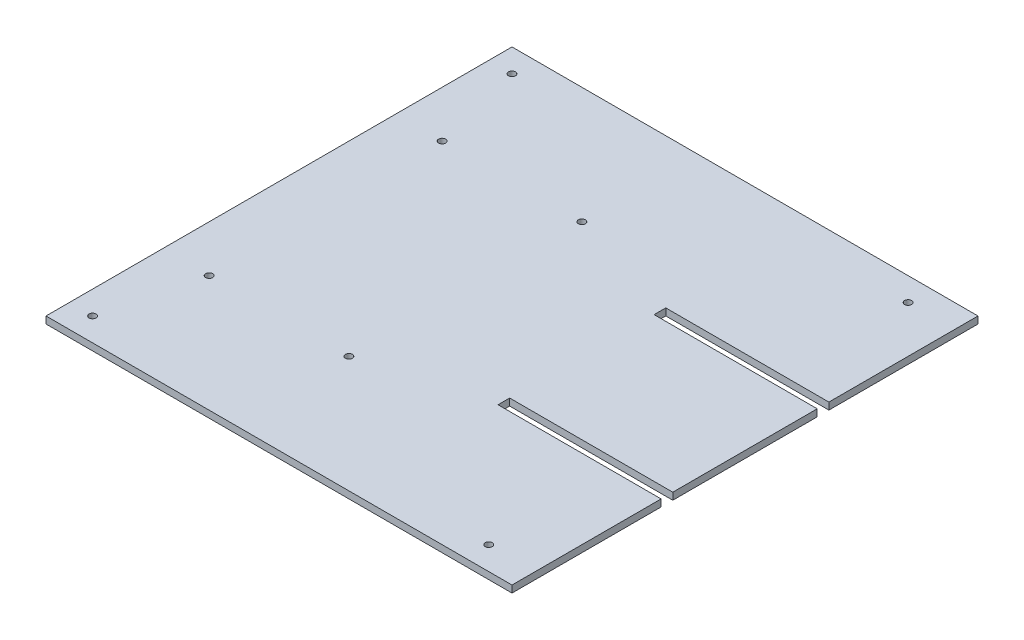
ISO-10303-21;
HEADER;
FILE_DESCRIPTION(('STEP AP214'),'2;1');
FILE_NAME('part.step','',(''),(''),'','','');
FILE_SCHEMA(('AUTOMOTIVE_DESIGN { 1 0 10303 214 1 1 1 1 }'));
ENDSEC;
DATA;
#1=APPLICATION_CONTEXT('core data for automotive mechanical design processes');
#2=APPLICATION_PROTOCOL_DEFINITION('international standard','automotive_design',2000,#1);
#3=PRODUCT_CONTEXT('',#1,'mechanical');
#4=PRODUCT('Part','Part','',(#3));
#5=PRODUCT_RELATED_PRODUCT_CATEGORY('part','',(#4));
#6=PRODUCT_DEFINITION_FORMATION('','',#4);
#7=PRODUCT_DEFINITION_CONTEXT('part definition',#1,'design');
#8=PRODUCT_DEFINITION('design','',#6,#7);
#9=PRODUCT_DEFINITION_SHAPE('','',#8);
#10=(LENGTH_UNIT() NAMED_UNIT(*) SI_UNIT(.MILLI.,.METRE.));
#11=(NAMED_UNIT(*) PLANE_ANGLE_UNIT() SI_UNIT($,.RADIAN.));
#12=(NAMED_UNIT(*) SI_UNIT($,.STERADIAN.) SOLID_ANGLE_UNIT());
#13=UNCERTAINTY_MEASURE_WITH_UNIT(LENGTH_MEASURE(1.E-05),#10,'distance_accuracy_value','');
#14=(GEOMETRIC_REPRESENTATION_CONTEXT(3) GLOBAL_UNCERTAINTY_ASSIGNED_CONTEXT((#13)) GLOBAL_UNIT_ASSIGNED_CONTEXT((#10,
#11,#12)) REPRESENTATION_CONTEXT('',''));
#15=CARTESIAN_POINT('',(0.,0.,0.));
#16=DIRECTION('',(0.,0.,1.));
#17=DIRECTION('',(1.,0.,0.));
#18=AXIS2_PLACEMENT_3D('',#15,#16,#17);
#19=CARTESIAN_POINT('',(100.,3.,100.));
#20=DIRECTION('',(-1.,0.,0.));
#21=DIRECTION('',(0.,0.,1.));
#22=AXIS2_PLACEMENT_3D('',#19,#20,#21);
#23=PLANE('',#22);
#24=DIRECTION('',(0.,0.,-1.));
#25=VECTOR('',#24,1.);
#26=CARTESIAN_POINT('',(100.,0.,100.));
#27=LINE('',#26,#25);
#28=CARTESIAN_POINT('',(100.,0.,31.));
#29=VERTEX_POINT('',#28);
#30=CARTESIAN_POINT('',(100.,0.,-31.));
#31=VERTEX_POINT('',#30);
#32=EDGE_CURVE('E146',#29,#31,#27,.T.);
#33=ORIENTED_EDGE('',*,*,#32,.T.);
#34=DIRECTION('',(0.,1.,0.));
#35=VECTOR('',#34,1.);
#36=CARTESIAN_POINT('',(100.,0.,-31.));
#37=LINE('',#36,#35);
#38=CARTESIAN_POINT('',(100.,3.,-31.));
#39=VERTEX_POINT('',#38);
#40=EDGE_CURVE('E194',#31,#39,#37,.T.);
#41=ORIENTED_EDGE('',*,*,#40,.T.);
#42=DIRECTION('',(0.,0.,-1.));
#43=VECTOR('',#42,1.);
#44=CARTESIAN_POINT('',(100.,3.,100.));
#45=LINE('',#44,#43);
#46=CARTESIAN_POINT('',(100.,3.,31.));
#47=VERTEX_POINT('',#46);
#48=EDGE_CURVE('E230',#47,#39,#45,.T.);
#49=ORIENTED_EDGE('',*,*,#48,.F.);
#50=DIRECTION('',(0.,1.,0.));
#51=VECTOR('',#50,1.);
#52=CARTESIAN_POINT('',(100.,0.,31.));
#53=LINE('',#52,#51);
#54=EDGE_CURVE('E182',#29,#47,#53,.T.);
#55=ORIENTED_EDGE('',*,*,#54,.F.);
#56=EDGE_LOOP('',(#33,#41,#49,#55));
#57=FACE_BOUND('',#56,.T.);
#58=ADVANCED_FACE('F34',(#57),#23,.F.);
#59=CARTESIAN_POINT('',(100.,0.,100.));
#60=VERTEX_POINT('',#59);
#61=CARTESIAN_POINT('',(100.,0.,36.));
#62=VERTEX_POINT('',#61);
#63=EDGE_CURVE('E149',#60,#62,#27,.T.);
#64=ORIENTED_EDGE('',*,*,#63,.T.);
#65=DIRECTION('',(0.,1.,0.));
#66=VECTOR('',#65,1.);
#67=CARTESIAN_POINT('',(100.,0.,36.));
#68=LINE('',#67,#66);
#69=CARTESIAN_POINT('',(100.,3.,36.));
#70=VERTEX_POINT('',#69);
#71=EDGE_CURVE('E199',#62,#70,#68,.T.);
#72=ORIENTED_EDGE('',*,*,#71,.T.);
#73=CARTESIAN_POINT('',(100.,3.,100.));
#74=VERTEX_POINT('',#73);
#75=EDGE_CURVE('E175',#74,#70,#45,.T.);
#76=ORIENTED_EDGE('',*,*,#75,.F.);
#77=DIRECTION('',(0.,-1.,0.));
#78=VECTOR('',#77,1.);
#79=CARTESIAN_POINT('',(100.,3.,100.));
#80=LINE('',#79,#78);
#81=EDGE_CURVE('E42',#74,#60,#80,.T.);
#82=ORIENTED_EDGE('',*,*,#81,.T.);
#83=EDGE_LOOP('',(#64,#72,#76,#82));
#84=FACE_BOUND('',#83,.T.);
#85=ADVANCED_FACE('F173',(#84),#23,.F.);
#86=CARTESIAN_POINT('',(-100.,3.,100.));
#87=DIRECTION('',(1.,0.,0.));
#88=DIRECTION('',(0.,0.,-1.));
#89=AXIS2_PLACEMENT_3D('',#86,#87,#88);
#90=PLANE('',#89);
#91=DIRECTION('',(0.,0.,1.));
#92=VECTOR('',#91,1.);
#93=CARTESIAN_POINT('',(-100.,0.,100.));
#94=LINE('',#93,#92);
#95=CARTESIAN_POINT('',(-100.,0.,-100.));
#96=VERTEX_POINT('',#95);
#97=CARTESIAN_POINT('',(-100.,0.,100.));
#98=VERTEX_POINT('',#97);
#99=EDGE_CURVE('E151',#96,#98,#94,.T.);
#100=ORIENTED_EDGE('',*,*,#99,.T.);
#101=DIRECTION('',(0.,-1.,0.));
#102=VECTOR('',#101,1.);
#103=CARTESIAN_POINT('',(-100.,3.,100.));
#104=LINE('',#103,#102);
#105=CARTESIAN_POINT('',(-100.,3.,100.));
#106=VERTEX_POINT('',#105);
#107=EDGE_CURVE('E11',#106,#98,#104,.T.);
#108=ORIENTED_EDGE('',*,*,#107,.F.);
#109=DIRECTION('',(0.,0.,1.));
#110=VECTOR('',#109,1.);
#111=CARTESIAN_POINT('',(-100.,3.,100.));
#112=LINE('',#111,#110);
#113=CARTESIAN_POINT('',(-100.,3.,-100.));
#114=VERTEX_POINT('',#113);
#115=EDGE_CURVE('E159',#114,#106,#112,.T.);
#116=ORIENTED_EDGE('',*,*,#115,.F.);
#117=DIRECTION('',(0.,-1.,0.));
#118=VECTOR('',#117,1.);
#119=CARTESIAN_POINT('',(-100.,3.,-100.));
#120=LINE('',#119,#118);
#121=EDGE_CURVE('E167',#114,#96,#120,.T.);
#122=ORIENTED_EDGE('',*,*,#121,.T.);
#123=EDGE_LOOP('',(#100,#108,#116,#122));
#124=FACE_BOUND('',#123,.T.);
#125=ADVANCED_FACE('F36',(#124),#90,.F.);
#126=CARTESIAN_POINT('',(100.,3.,100.));
#127=DIRECTION('',(0.,0.,-1.));
#128=DIRECTION('',(-1.,0.,0.));
#129=AXIS2_PLACEMENT_3D('',#126,#127,#128);
#130=PLANE('',#129);
#131=DIRECTION('',(1.,0.,0.));
#132=VECTOR('',#131,1.);
#133=CARTESIAN_POINT('',(100.,0.,100.));
#134=LINE('',#133,#132);
#135=EDGE_CURVE('E147',#98,#60,#134,.T.);
#136=ORIENTED_EDGE('',*,*,#135,.T.);
#137=ORIENTED_EDGE('',*,*,#81,.F.);
#138=DIRECTION('',(1.,0.,0.));
#139=VECTOR('',#138,1.);
#140=CARTESIAN_POINT('',(100.,3.,100.));
#141=LINE('',#140,#139);
#142=EDGE_CURVE('E164',#106,#74,#141,.T.);
#143=ORIENTED_EDGE('',*,*,#142,.F.);
#144=ORIENTED_EDGE('',*,*,#107,.T.);
#145=EDGE_LOOP('',(#136,#137,#143,#144));
#146=FACE_BOUND('',#145,.T.);
#147=ADVANCED_FACE('F285',(#146),#130,.F.);
#148=CARTESIAN_POINT('',(100.,3.,-36.));
#149=VERTEX_POINT('',#148);
#150=CARTESIAN_POINT('',(100.,3.,-100.));
#151=VERTEX_POINT('',#150);
#152=EDGE_CURVE('E139',#149,#151,#45,.T.);
#153=ORIENTED_EDGE('',*,*,#152,.F.);
#154=DIRECTION('',(0.,1.,0.));
#155=VECTOR('',#154,1.);
#156=CARTESIAN_POINT('',(100.,0.,-36.));
#157=LINE('',#156,#155);
#158=CARTESIAN_POINT('',(100.,0.,-36.));
#159=VERTEX_POINT('',#158);
#160=EDGE_CURVE('E126',#159,#149,#157,.T.);
#161=ORIENTED_EDGE('',*,*,#160,.F.);
#162=CARTESIAN_POINT('',(100.,0.,-100.));
#163=VERTEX_POINT('',#162);
#164=EDGE_CURVE('E137',#159,#163,#27,.T.);
#165=ORIENTED_EDGE('',*,*,#164,.T.);
#166=DIRECTION('',(0.,-1.,0.));
#167=VECTOR('',#166,1.);
#168=CARTESIAN_POINT('',(100.,3.,-100.));
#169=LINE('',#168,#167);
#170=EDGE_CURVE('E169',#151,#163,#169,.T.);
#171=ORIENTED_EDGE('',*,*,#170,.F.);
#172=EDGE_LOOP('',(#153,#161,#165,#171));
#173=FACE_BOUND('',#172,.T.);
#174=ADVANCED_FACE('F135',(#173),#23,.F.);
#175=CARTESIAN_POINT('',(100.,3.,-100.));
#176=DIRECTION('',(0.,0.,1.));
#177=DIRECTION('',(1.,0.,0.));
#178=AXIS2_PLACEMENT_3D('',#175,#176,#177);
#179=PLANE('',#178);
#180=DIRECTION('',(-1.,0.,0.));
#181=VECTOR('',#180,1.);
#182=CARTESIAN_POINT('',(100.,0.,-100.));
#183=LINE('',#182,#181);
#184=EDGE_CURVE('E145',#163,#96,#183,.T.);
#185=ORIENTED_EDGE('',*,*,#184,.T.);
#186=ORIENTED_EDGE('',*,*,#121,.F.);
#187=DIRECTION('',(-1.,0.,0.));
#188=VECTOR('',#187,1.);
#189=CARTESIAN_POINT('',(100.,3.,-100.));
#190=LINE('',#189,#188);
#191=EDGE_CURVE('E170',#151,#114,#190,.T.);
#192=ORIENTED_EDGE('',*,*,#191,.F.);
#193=ORIENTED_EDGE('',*,*,#170,.T.);
#194=EDGE_LOOP('',(#185,#186,#192,#193));
#195=FACE_BOUND('',#194,.T.);
#196=ADVANCED_FACE('F237',(#195),#179,.F.);
#197=CARTESIAN_POINT('',(0.,3.,0.));
#198=DIRECTION('',(0.,1.,0.));
#199=DIRECTION('',(0.,0.,1.));
#200=AXIS2_PLACEMENT_3D('',#197,#198,#199);
#201=PLANE('',#200);
#202=CARTESIAN_POINT('',(-20.,3.,-50.));
#203=DIRECTION('',(0.,1.,0.));
#204=DIRECTION('',(0.,0.,1.));
#205=AXIS2_PLACEMENT_3D('',#202,#203,#204);
#206=CIRCLE('',#205,1.5);
#207=CARTESIAN_POINT('',(-20.,3.,-48.5));
#208=VERTEX_POINT('',#207);
#209=EDGE_CURVE('E423',#208,#208,#206,.T.);
#210=ORIENTED_EDGE('',*,*,#209,.F.);
#211=EDGE_LOOP('',(#210));
#212=FACE_BOUND('',#211,.T.);
#213=CARTESIAN_POINT('',(-80.,3.,-50.));
#214=DIRECTION('',(0.,1.,0.));
#215=DIRECTION('',(0.,0.,1.));
#216=AXIS2_PLACEMENT_3D('',#213,#214,#215);
#217=CIRCLE('',#216,1.5);
#218=CARTESIAN_POINT('',(-80.,3.,-48.5));
#219=VERTEX_POINT('',#218);
#220=EDGE_CURVE('E425',#219,#219,#217,.T.);
#221=ORIENTED_EDGE('',*,*,#220,.F.);
#222=EDGE_LOOP('',(#221));
#223=FACE_BOUND('',#222,.T.);
#224=CARTESIAN_POINT('',(-20.,3.,50.0000000000001));
#225=DIRECTION('',(0.,1.,0.));
#226=DIRECTION('',(0.,0.,1.));
#227=AXIS2_PLACEMENT_3D('',#224,#225,#226);
#228=CIRCLE('',#227,1.5);
#229=CARTESIAN_POINT('',(-20.,3.,51.5000000000001));
#230=VERTEX_POINT('',#229);
#231=EDGE_CURVE('E431',#230,#230,#228,.T.);
#232=ORIENTED_EDGE('',*,*,#231,.F.);
#233=EDGE_LOOP('',(#232));
#234=FACE_BOUND('',#233,.T.);
#235=CARTESIAN_POINT('',(-80.,3.,50.));
#236=DIRECTION('',(0.,1.,0.));
#237=DIRECTION('',(0.,0.,1.));
#238=AXIS2_PLACEMENT_3D('',#235,#236,#237);
#239=CIRCLE('',#238,1.5);
#240=CARTESIAN_POINT('',(-80.,3.,51.5));
#241=VERTEX_POINT('',#240);
#242=EDGE_CURVE('E437',#241,#241,#239,.T.);
#243=ORIENTED_EDGE('',*,*,#242,.F.);
#244=EDGE_LOOP('',(#243));
#245=FACE_BOUND('',#244,.T.);
#246=DIRECTION('',(1.,0.,0.));
#247=VECTOR('',#246,1.);
#248=CARTESIAN_POINT('',(30.,3.,-31.));
#249=LINE('',#248,#247);
#250=CARTESIAN_POINT('',(30.,3.,-31.));
#251=VERTEX_POINT('',#250);
#252=EDGE_CURVE('E131',#251,#39,#249,.T.);
#253=ORIENTED_EDGE('',*,*,#252,.F.);
#254=DIRECTION('',(0.,0.,1.));
#255=VECTOR('',#254,1.);
#256=CARTESIAN_POINT('',(30.,3.,-36.));
#257=LINE('',#256,#255);
#258=CARTESIAN_POINT('',(30.,3.,-36.));
#259=VERTEX_POINT('',#258);
#260=EDGE_CURVE('E447',#259,#251,#257,.T.);
#261=ORIENTED_EDGE('',*,*,#260,.F.);
#262=DIRECTION('',(-1.,0.,0.));
#263=VECTOR('',#262,1.);
#264=CARTESIAN_POINT('',(100.,3.,-36.));
#265=LINE('',#264,#263);
#266=EDGE_CURVE('E243',#149,#259,#265,.T.);
#267=ORIENTED_EDGE('',*,*,#266,.F.);
#268=ORIENTED_EDGE('',*,*,#152,.T.);
#269=ORIENTED_EDGE('',*,*,#191,.T.);
#270=ORIENTED_EDGE('',*,*,#115,.T.);
#271=ORIENTED_EDGE('',*,*,#142,.T.);
#272=ORIENTED_EDGE('',*,*,#75,.T.);
#273=DIRECTION('',(1.,0.,0.));
#274=VECTOR('',#273,1.);
#275=CARTESIAN_POINT('',(100.,3.,36.));
#276=LINE('',#275,#274);
#277=CARTESIAN_POINT('',(30.,3.,36.));
#278=VERTEX_POINT('',#277);
#279=EDGE_CURVE('E197',#278,#70,#276,.T.);
#280=ORIENTED_EDGE('',*,*,#279,.F.);
#281=DIRECTION('',(0.,0.,1.));
#282=VECTOR('',#281,1.);
#283=CARTESIAN_POINT('',(30.,3.,36.));
#284=LINE('',#283,#282);
#285=CARTESIAN_POINT('',(30.,3.,31.));
#286=VERTEX_POINT('',#285);
#287=EDGE_CURVE('E193',#286,#278,#284,.T.);
#288=ORIENTED_EDGE('',*,*,#287,.F.);
#289=DIRECTION('',(-1.,0.,0.));
#290=VECTOR('',#289,1.);
#291=CARTESIAN_POINT('',(30.,3.,31.));
#292=LINE('',#291,#290);
#293=EDGE_CURVE('E190',#47,#286,#292,.T.);
#294=ORIENTED_EDGE('',*,*,#293,.F.);
#295=ORIENTED_EDGE('',*,*,#48,.T.);
#296=EDGE_LOOP('',(#253,#261,#267,#268,#269,#270,#271,#272,#280,#288,#294,#295));
#297=FACE_BOUND('',#296,.T.);
#298=CARTESIAN_POINT('',(-90.0000000000001,3.,-90.));
#299=DIRECTION('',(0.,1.,0.));
#300=DIRECTION('',(0.,0.,-1.));
#301=AXIS2_PLACEMENT_3D('',#298,#299,#300);
#302=CIRCLE('',#301,1.5);
#303=CARTESIAN_POINT('',(-90.0000000000001,3.,-91.5));
#304=VERTEX_POINT('',#303);
#305=EDGE_CURVE('E201',#304,#304,#302,.T.);
#306=ORIENTED_EDGE('',*,*,#305,.F.);
#307=EDGE_LOOP('',(#306));
#308=FACE_BOUND('',#307,.T.);
#309=CARTESIAN_POINT('',(80.,3.,-90.));
#310=DIRECTION('',(0.,1.,0.));
#311=DIRECTION('',(0.,0.,-1.));
#312=AXIS2_PLACEMENT_3D('',#309,#310,#311);
#313=CIRCLE('',#312,1.5);
#314=CARTESIAN_POINT('',(80.,3.,-91.5));
#315=VERTEX_POINT('',#314);
#316=EDGE_CURVE('E208',#315,#315,#313,.T.);
#317=ORIENTED_EDGE('',*,*,#316,.F.);
#318=EDGE_LOOP('',(#317));
#319=FACE_BOUND('',#318,.T.);
#320=CARTESIAN_POINT('',(80.,3.,90.));
#321=DIRECTION('',(0.,1.,0.));
#322=DIRECTION('',(0.,0.,1.));
#323=AXIS2_PLACEMENT_3D('',#320,#321,#322);
#324=CIRCLE('',#323,1.5);
#325=CARTESIAN_POINT('',(80.,3.,91.5));
#326=VERTEX_POINT('',#325);
#327=EDGE_CURVE('E214',#326,#326,#324,.T.);
#328=ORIENTED_EDGE('',*,*,#327,.F.);
#329=EDGE_LOOP('',(#328));
#330=FACE_BOUND('',#329,.T.);
#331=CARTESIAN_POINT('',(-90.,3.,90.));
#332=DIRECTION('',(0.,1.,0.));
#333=DIRECTION('',(0.,0.,1.));
#334=AXIS2_PLACEMENT_3D('',#331,#332,#333);
#335=CIRCLE('',#334,1.5);
#336=CARTESIAN_POINT('',(-90.,3.,91.5));
#337=VERTEX_POINT('',#336);
#338=EDGE_CURVE('E220',#337,#337,#335,.T.);
#339=ORIENTED_EDGE('',*,*,#338,.F.);
#340=EDGE_LOOP('',(#339));
#341=FACE_BOUND('',#340,.T.);
#342=ADVANCED_FACE('F240',(#212,#223,#234,#245,#297,#308,#319,#330,#341),#201,.T.);
#343=CARTESIAN_POINT('',(0.,0.,0.));
#344=DIRECTION('',(0.,1.,0.));
#345=DIRECTION('',(0.,0.,1.));
#346=AXIS2_PLACEMENT_3D('',#343,#344,#345);
#347=PLANE('',#346);
#348=CARTESIAN_POINT('',(-20.,0.,-50.));
#349=DIRECTION('',(0.,1.,0.));
#350=DIRECTION('',(0.,0.,1.));
#351=AXIS2_PLACEMENT_3D('',#348,#349,#350);
#352=CIRCLE('',#351,1.5);
#353=CARTESIAN_POINT('',(-20.,0.,-48.5));
#354=VERTEX_POINT('',#353);
#355=EDGE_CURVE('E420',#354,#354,#352,.T.);
#356=ORIENTED_EDGE('',*,*,#355,.T.);
#357=EDGE_LOOP('',(#356));
#358=FACE_BOUND('',#357,.T.);
#359=CARTESIAN_POINT('',(-80.,0.,-50.));
#360=DIRECTION('',(0.,1.,0.));
#361=DIRECTION('',(0.,0.,1.));
#362=AXIS2_PLACEMENT_3D('',#359,#360,#361);
#363=CIRCLE('',#362,1.5);
#364=CARTESIAN_POINT('',(-80.,0.,-48.5));
#365=VERTEX_POINT('',#364);
#366=EDGE_CURVE('E428',#365,#365,#363,.T.);
#367=ORIENTED_EDGE('',*,*,#366,.T.);
#368=EDGE_LOOP('',(#367));
#369=FACE_BOUND('',#368,.T.);
#370=CARTESIAN_POINT('',(-20.,0.,50.0000000000001));
#371=DIRECTION('',(0.,1.,0.));
#372=DIRECTION('',(0.,0.,1.));
#373=AXIS2_PLACEMENT_3D('',#370,#371,#372);
#374=CIRCLE('',#373,1.5);
#375=CARTESIAN_POINT('',(-20.,0.,51.5000000000001));
#376=VERTEX_POINT('',#375);
#377=EDGE_CURVE('E434',#376,#376,#374,.T.);
#378=ORIENTED_EDGE('',*,*,#377,.T.);
#379=EDGE_LOOP('',(#378));
#380=FACE_BOUND('',#379,.T.);
#381=CARTESIAN_POINT('',(-80.,0.,50.));
#382=DIRECTION('',(0.,1.,0.));
#383=DIRECTION('',(0.,0.,1.));
#384=AXIS2_PLACEMENT_3D('',#381,#382,#383);
#385=CIRCLE('',#384,1.5);
#386=CARTESIAN_POINT('',(-80.,0.,51.5));
#387=VERTEX_POINT('',#386);
#388=EDGE_CURVE('E440',#387,#387,#385,.T.);
#389=ORIENTED_EDGE('',*,*,#388,.T.);
#390=EDGE_LOOP('',(#389));
#391=FACE_BOUND('',#390,.T.);
#392=CARTESIAN_POINT('',(-90.0000000000001,0.,-90.));
#393=DIRECTION('',(0.,1.,0.));
#394=DIRECTION('',(0.,0.,-1.));
#395=AXIS2_PLACEMENT_3D('',#392,#393,#394);
#396=CIRCLE('',#395,1.5);
#397=CARTESIAN_POINT('',(-90.0000000000001,0.,-91.5));
#398=VERTEX_POINT('',#397);
#399=EDGE_CURVE('E205',#398,#398,#396,.T.);
#400=ORIENTED_EDGE('',*,*,#399,.T.);
#401=EDGE_LOOP('',(#400));
#402=FACE_BOUND('',#401,.T.);
#403=CARTESIAN_POINT('',(80.,0.,-90.));
#404=DIRECTION('',(0.,1.,0.));
#405=DIRECTION('',(0.,0.,-1.));
#406=AXIS2_PLACEMENT_3D('',#403,#404,#405);
#407=CIRCLE('',#406,1.5);
#408=CARTESIAN_POINT('',(80.,0.,-91.5));
#409=VERTEX_POINT('',#408);
#410=EDGE_CURVE('E211',#409,#409,#407,.T.);
#411=ORIENTED_EDGE('',*,*,#410,.T.);
#412=EDGE_LOOP('',(#411));
#413=FACE_BOUND('',#412,.T.);
#414=CARTESIAN_POINT('',(80.,0.,90.));
#415=DIRECTION('',(0.,1.,0.));
#416=DIRECTION('',(0.,0.,1.));
#417=AXIS2_PLACEMENT_3D('',#414,#415,#416);
#418=CIRCLE('',#417,1.5);
#419=CARTESIAN_POINT('',(80.,0.,91.5));
#420=VERTEX_POINT('',#419);
#421=EDGE_CURVE('E217',#420,#420,#418,.T.);
#422=ORIENTED_EDGE('',*,*,#421,.T.);
#423=EDGE_LOOP('',(#422));
#424=FACE_BOUND('',#423,.T.);
#425=CARTESIAN_POINT('',(-90.,0.,90.));
#426=DIRECTION('',(0.,1.,0.));
#427=DIRECTION('',(0.,0.,1.));
#428=AXIS2_PLACEMENT_3D('',#425,#426,#427);
#429=CIRCLE('',#428,1.5);
#430=CARTESIAN_POINT('',(-90.,0.,91.5));
#431=VERTEX_POINT('',#430);
#432=EDGE_CURVE('E223',#431,#431,#429,.T.);
#433=ORIENTED_EDGE('',*,*,#432,.T.);
#434=EDGE_LOOP('',(#433));
#435=FACE_BOUND('',#434,.T.);
#436=DIRECTION('',(0.,0.,1.));
#437=VECTOR('',#436,1.);
#438=CARTESIAN_POINT('',(30.,0.,-36.));
#439=LINE('',#438,#437);
#440=CARTESIAN_POINT('',(30.,0.,-36.));
#441=VERTEX_POINT('',#440);
#442=CARTESIAN_POINT('',(30.,0.,-31.));
#443=VERTEX_POINT('',#442);
#444=EDGE_CURVE('E49',#441,#443,#439,.T.);
#445=ORIENTED_EDGE('',*,*,#444,.T.);
#446=DIRECTION('',(1.,0.,0.));
#447=VECTOR('',#446,1.);
#448=CARTESIAN_POINT('',(30.,0.,-31.));
#449=LINE('',#448,#447);
#450=EDGE_CURVE('E140',#443,#31,#449,.T.);
#451=ORIENTED_EDGE('',*,*,#450,.T.);
#452=ORIENTED_EDGE('',*,*,#32,.F.);
#453=DIRECTION('',(-1.,0.,0.));
#454=VECTOR('',#453,1.);
#455=CARTESIAN_POINT('',(30.,0.,31.));
#456=LINE('',#455,#454);
#457=CARTESIAN_POINT('',(30.,0.,31.));
#458=VERTEX_POINT('',#457);
#459=EDGE_CURVE('E186',#29,#458,#456,.T.);
#460=ORIENTED_EDGE('',*,*,#459,.T.);
#461=DIRECTION('',(0.,0.,1.));
#462=VECTOR('',#461,1.);
#463=CARTESIAN_POINT('',(30.,0.,36.));
#464=LINE('',#463,#462);
#465=CARTESIAN_POINT('',(30.,0.,36.));
#466=VERTEX_POINT('',#465);
#467=EDGE_CURVE('E57',#458,#466,#464,.T.);
#468=ORIENTED_EDGE('',*,*,#467,.T.);
#469=DIRECTION('',(1.,0.,0.));
#470=VECTOR('',#469,1.);
#471=CARTESIAN_POINT('',(100.,0.,36.));
#472=LINE('',#471,#470);
#473=EDGE_CURVE('E179',#466,#62,#472,.T.);
#474=ORIENTED_EDGE('',*,*,#473,.T.);
#475=ORIENTED_EDGE('',*,*,#63,.F.);
#476=ORIENTED_EDGE('',*,*,#135,.F.);
#477=ORIENTED_EDGE('',*,*,#99,.F.);
#478=ORIENTED_EDGE('',*,*,#184,.F.);
#479=ORIENTED_EDGE('',*,*,#164,.F.);
#480=DIRECTION('',(-1.,0.,0.));
#481=VECTOR('',#480,1.);
#482=CARTESIAN_POINT('',(100.,0.,-36.));
#483=LINE('',#482,#481);
#484=EDGE_CURVE('E122',#159,#441,#483,.T.);
#485=ORIENTED_EDGE('',*,*,#484,.T.);
#486=EDGE_LOOP('',(#445,#451,#452,#460,#468,#474,#475,#476,#477,#478,#479,#485));
#487=FACE_BOUND('',#486,.T.);
#488=ADVANCED_FACE('F143',(#358,#369,#380,#391,#402,#413,#424,#435,#487),#347,.F.);
#489=CARTESIAN_POINT('',(-90.,0.,90.));
#490=DIRECTION('',(0.,1.,0.));
#491=DIRECTION('',(0.,0.,1.));
#492=AXIS2_PLACEMENT_3D('',#489,#490,#491);
#493=CYLINDRICAL_SURFACE('',#492,1.5);
#494=ORIENTED_EDGE('',*,*,#432,.F.);
#495=EDGE_LOOP('',(#494));
#496=FACE_BOUND('',#495,.T.);
#497=ORIENTED_EDGE('',*,*,#338,.T.);
#498=EDGE_LOOP('',(#497));
#499=FACE_BOUND('',#498,.T.);
#500=ADVANCED_FACE('F373',(#496,#499),#493,.F.);
#501=CARTESIAN_POINT('',(80.,0.,90.));
#502=DIRECTION('',(0.,1.,0.));
#503=DIRECTION('',(0.,0.,1.));
#504=AXIS2_PLACEMENT_3D('',#501,#502,#503);
#505=CYLINDRICAL_SURFACE('',#504,1.5);
#506=ORIENTED_EDGE('',*,*,#421,.F.);
#507=EDGE_LOOP('',(#506));
#508=FACE_BOUND('',#507,.T.);
#509=ORIENTED_EDGE('',*,*,#327,.T.);
#510=EDGE_LOOP('',(#509));
#511=FACE_BOUND('',#510,.T.);
#512=ADVANCED_FACE('F464',(#508,#511),#505,.F.);
#513=CARTESIAN_POINT('',(80.,0.,-90.));
#514=DIRECTION('',(0.,1.,0.));
#515=DIRECTION('',(0.,0.,1.));
#516=AXIS2_PLACEMENT_3D('',#513,#514,#515);
#517=CYLINDRICAL_SURFACE('',#516,1.5);
#518=ORIENTED_EDGE('',*,*,#410,.F.);
#519=EDGE_LOOP('',(#518));
#520=FACE_BOUND('',#519,.T.);
#521=ORIENTED_EDGE('',*,*,#316,.T.);
#522=EDGE_LOOP('',(#521));
#523=FACE_BOUND('',#522,.T.);
#524=ADVANCED_FACE('F274',(#520,#523),#517,.F.);
#525=CARTESIAN_POINT('',(-90.0000000000001,0.,-90.));
#526=DIRECTION('',(0.,1.,0.));
#527=DIRECTION('',(0.,0.,1.));
#528=AXIS2_PLACEMENT_3D('',#525,#526,#527);
#529=CYLINDRICAL_SURFACE('',#528,1.5);
#530=ORIENTED_EDGE('',*,*,#399,.F.);
#531=EDGE_LOOP('',(#530));
#532=FACE_BOUND('',#531,.T.);
#533=ORIENTED_EDGE('',*,*,#305,.T.);
#534=EDGE_LOOP('',(#533));
#535=FACE_BOUND('',#534,.T.);
#536=ADVANCED_FACE('F267',(#532,#535),#529,.F.);
#537=CARTESIAN_POINT('',(100.,0.,36.));
#538=DIRECTION('',(0.,0.,1.));
#539=DIRECTION('',(1.,0.,0.));
#540=AXIS2_PLACEMENT_3D('',#537,#538,#539);
#541=PLANE('',#540);
#542=ORIENTED_EDGE('',*,*,#279,.T.);
#543=ORIENTED_EDGE('',*,*,#71,.F.);
#544=ORIENTED_EDGE('',*,*,#473,.F.);
#545=DIRECTION('',(0.,1.,0.));
#546=VECTOR('',#545,1.);
#547=CARTESIAN_POINT('',(30.,0.,36.));
#548=LINE('',#547,#546);
#549=EDGE_CURVE('E202',#466,#278,#548,.T.);
#550=ORIENTED_EDGE('',*,*,#549,.T.);
#551=EDGE_LOOP('',(#542,#543,#544,#550));
#552=FACE_BOUND('',#551,.T.);
#553=ADVANCED_FACE('F265',(#552),#541,.F.);
#554=CARTESIAN_POINT('',(30.,0.,36.));
#555=DIRECTION('',(-1.,0.,0.));
#556=DIRECTION('',(0.,0.,1.));
#557=AXIS2_PLACEMENT_3D('',#554,#555,#556);
#558=PLANE('',#557);
#559=ORIENTED_EDGE('',*,*,#287,.T.);
#560=ORIENTED_EDGE('',*,*,#549,.F.);
#561=ORIENTED_EDGE('',*,*,#467,.F.);
#562=DIRECTION('',(0.,1.,0.));
#563=VECTOR('',#562,1.);
#564=CARTESIAN_POINT('',(30.,0.,31.));
#565=LINE('',#564,#563);
#566=EDGE_CURVE('E184',#458,#286,#565,.T.);
#567=ORIENTED_EDGE('',*,*,#566,.T.);
#568=EDGE_LOOP('',(#559,#560,#561,#567));
#569=FACE_BOUND('',#568,.T.);
#570=ADVANCED_FACE('F263',(#569),#558,.F.);
#571=CARTESIAN_POINT('',(30.,0.,31.));
#572=DIRECTION('',(0.,0.,-1.));
#573=DIRECTION('',(-1.,0.,0.));
#574=AXIS2_PLACEMENT_3D('',#571,#572,#573);
#575=PLANE('',#574);
#576=ORIENTED_EDGE('',*,*,#293,.T.);
#577=ORIENTED_EDGE('',*,*,#566,.F.);
#578=ORIENTED_EDGE('',*,*,#459,.F.);
#579=ORIENTED_EDGE('',*,*,#54,.T.);
#580=EDGE_LOOP('',(#576,#577,#578,#579));
#581=FACE_BOUND('',#580,.T.);
#582=ADVANCED_FACE('F262',(#581),#575,.F.);
#583=CARTESIAN_POINT('',(30.,0.,-31.));
#584=DIRECTION('',(0.,0.,1.));
#585=DIRECTION('',(1.,0.,0.));
#586=AXIS2_PLACEMENT_3D('',#583,#584,#585);
#587=PLANE('',#586);
#588=ORIENTED_EDGE('',*,*,#252,.T.);
#589=ORIENTED_EDGE('',*,*,#40,.F.);
#590=ORIENTED_EDGE('',*,*,#450,.F.);
#591=DIRECTION('',(0.,1.,0.));
#592=VECTOR('',#591,1.);
#593=CARTESIAN_POINT('',(30.,0.,-31.));
#594=LINE('',#593,#592);
#595=EDGE_CURVE('E255',#443,#251,#594,.T.);
#596=ORIENTED_EDGE('',*,*,#595,.T.);
#597=EDGE_LOOP('',(#588,#589,#590,#596));
#598=FACE_BOUND('',#597,.T.);
#599=ADVANCED_FACE('F328',(#598),#587,.F.);
#600=CARTESIAN_POINT('',(30.,0.,-36.));
#601=DIRECTION('',(-1.,0.,0.));
#602=DIRECTION('',(0.,0.,1.));
#603=AXIS2_PLACEMENT_3D('',#600,#601,#602);
#604=PLANE('',#603);
#605=ORIENTED_EDGE('',*,*,#260,.T.);
#606=ORIENTED_EDGE('',*,*,#595,.F.);
#607=ORIENTED_EDGE('',*,*,#444,.F.);
#608=DIRECTION('',(0.,1.,0.));
#609=VECTOR('',#608,1.);
#610=CARTESIAN_POINT('',(30.,0.,-36.));
#611=LINE('',#610,#609);
#612=EDGE_CURVE('E128',#441,#259,#611,.T.);
#613=ORIENTED_EDGE('',*,*,#612,.T.);
#614=EDGE_LOOP('',(#605,#606,#607,#613));
#615=FACE_BOUND('',#614,.T.);
#616=ADVANCED_FACE('F337',(#615),#604,.F.);
#617=CARTESIAN_POINT('',(100.,0.,-36.));
#618=DIRECTION('',(0.,0.,-1.));
#619=DIRECTION('',(-1.,0.,0.));
#620=AXIS2_PLACEMENT_3D('',#617,#618,#619);
#621=PLANE('',#620);
#622=ORIENTED_EDGE('',*,*,#266,.T.);
#623=ORIENTED_EDGE('',*,*,#612,.F.);
#624=ORIENTED_EDGE('',*,*,#484,.F.);
#625=ORIENTED_EDGE('',*,*,#160,.T.);
#626=EDGE_LOOP('',(#622,#623,#624,#625));
#627=FACE_BOUND('',#626,.T.);
#628=ADVANCED_FACE('F125',(#627),#621,.F.);
#629=CARTESIAN_POINT('',(-80.,0.,50.));
#630=DIRECTION('',(0.,1.,0.));
#631=DIRECTION('',(0.,0.,1.));
#632=AXIS2_PLACEMENT_3D('',#629,#630,#631);
#633=CYLINDRICAL_SURFACE('',#632,1.5);
#634=ORIENTED_EDGE('',*,*,#388,.F.);
#635=EDGE_LOOP('',(#634));
#636=FACE_BOUND('',#635,.T.);
#637=ORIENTED_EDGE('',*,*,#242,.T.);
#638=EDGE_LOOP('',(#637));
#639=FACE_BOUND('',#638,.T.);
#640=ADVANCED_FACE('F354',(#636,#639),#633,.F.);
#641=CARTESIAN_POINT('',(-20.,0.,50.0000000000001));
#642=DIRECTION('',(0.,1.,0.));
#643=DIRECTION('',(0.,0.,1.));
#644=AXIS2_PLACEMENT_3D('',#641,#642,#643);
#645=CYLINDRICAL_SURFACE('',#644,1.5);
#646=ORIENTED_EDGE('',*,*,#377,.F.);
#647=EDGE_LOOP('',(#646));
#648=FACE_BOUND('',#647,.T.);
#649=ORIENTED_EDGE('',*,*,#231,.T.);
#650=EDGE_LOOP('',(#649));
#651=FACE_BOUND('',#650,.T.);
#652=ADVANCED_FACE('F383',(#648,#651),#645,.F.);
#653=CARTESIAN_POINT('',(-80.,0.,-50.));
#654=DIRECTION('',(0.,1.,0.));
#655=DIRECTION('',(0.,0.,1.));
#656=AXIS2_PLACEMENT_3D('',#653,#654,#655);
#657=CYLINDRICAL_SURFACE('',#656,1.5);
#658=ORIENTED_EDGE('',*,*,#366,.F.);
#659=EDGE_LOOP('',(#658));
#660=FACE_BOUND('',#659,.T.);
#661=ORIENTED_EDGE('',*,*,#220,.T.);
#662=EDGE_LOOP('',(#661));
#663=FACE_BOUND('',#662,.T.);
#664=ADVANCED_FACE('F393',(#660,#663),#657,.F.);
#665=CARTESIAN_POINT('',(-20.,0.,-50.));
#666=DIRECTION('',(0.,1.,0.));
#667=DIRECTION('',(0.,0.,1.));
#668=AXIS2_PLACEMENT_3D('',#665,#666,#667);
#669=CYLINDRICAL_SURFACE('',#668,1.5);
#670=ORIENTED_EDGE('',*,*,#355,.F.);
#671=EDGE_LOOP('',(#670));
#672=FACE_BOUND('',#671,.T.);
#673=ORIENTED_EDGE('',*,*,#209,.T.);
#674=EDGE_LOOP('',(#673));
#675=FACE_BOUND('',#674,.T.);
#676=ADVANCED_FACE('F403',(#672,#675),#669,.F.);
#677=CLOSED_SHELL('',(#58,#85,#125,#147,#174,#196,#342,#488,#500,#512,#524,#536,#553,#570,#582,
#599,#616,#628,#640,#652,#664,#676));
#678=MANIFOLD_SOLID_BREP('B2',#677);
#679=ADVANCED_BREP_SHAPE_REPRESENTATION('',(#18,#678),#14);
#680=SHAPE_DEFINITION_REPRESENTATION(#9,#679);
ENDSEC;
END-ISO-10303-21;
